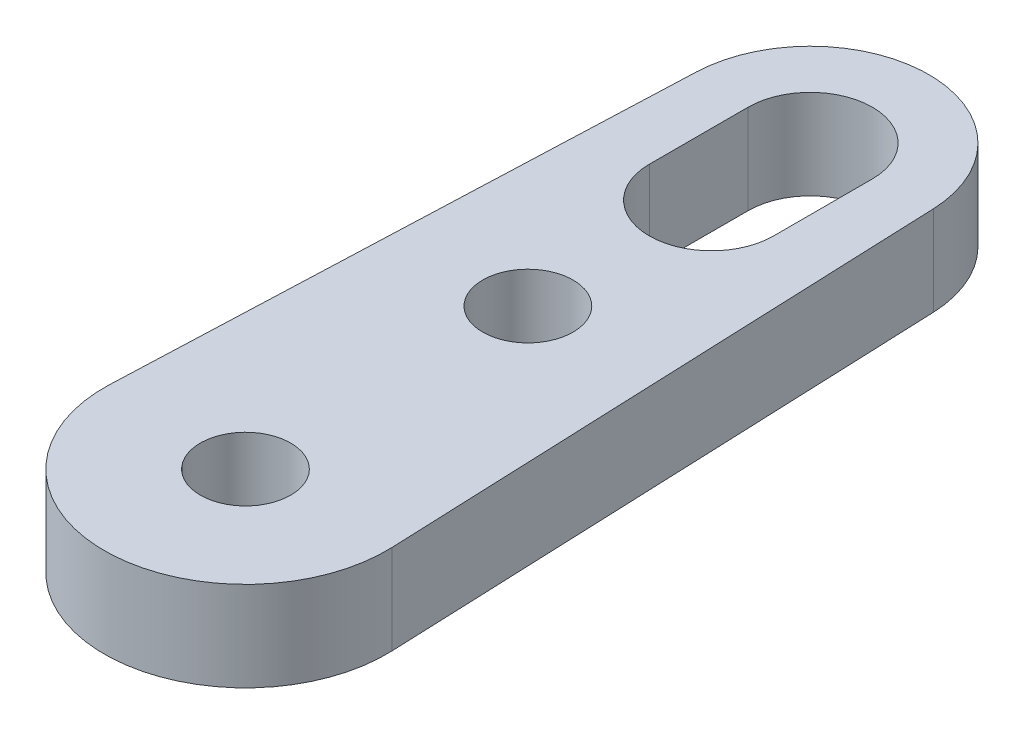
ISO-10303-21;
HEADER;
FILE_DESCRIPTION(('STEP AP214'),'2;1');
FILE_NAME('part.step','',(''),(''),'','','');
FILE_SCHEMA(('AUTOMOTIVE_DESIGN { 1 0 10303 214 1 1 1 1 }'));
ENDSEC;
DATA;
#1=APPLICATION_CONTEXT('core data for automotive mechanical design processes');
#2=APPLICATION_PROTOCOL_DEFINITION('international standard','automotive_design',2000,#1);
#3=PRODUCT_CONTEXT('',#1,'mechanical');
#4=PRODUCT('Part','Part','',(#3));
#5=PRODUCT_RELATED_PRODUCT_CATEGORY('part','',(#4));
#6=PRODUCT_DEFINITION_FORMATION('','',#4);
#7=PRODUCT_DEFINITION_CONTEXT('part definition',#1,'design');
#8=PRODUCT_DEFINITION('design','',#6,#7);
#9=PRODUCT_DEFINITION_SHAPE('','',#8);
#10=(LENGTH_UNIT() NAMED_UNIT(*) SI_UNIT(.MILLI.,.METRE.));
#11=(NAMED_UNIT(*) PLANE_ANGLE_UNIT() SI_UNIT($,.RADIAN.));
#12=(NAMED_UNIT(*) SI_UNIT($,.STERADIAN.) SOLID_ANGLE_UNIT());
#13=UNCERTAINTY_MEASURE_WITH_UNIT(LENGTH_MEASURE(1.E-05),#10,'distance_accuracy_value','');
#14=(GEOMETRIC_REPRESENTATION_CONTEXT(3) GLOBAL_UNCERTAINTY_ASSIGNED_CONTEXT((#13)) GLOBAL_UNIT_ASSIGNED_CONTEXT((#10,
#11,#12)) REPRESENTATION_CONTEXT('',''));
#15=CARTESIAN_POINT('',(0.,0.,0.));
#16=DIRECTION('',(0.,0.,1.));
#17=DIRECTION('',(1.,0.,0.));
#18=AXIS2_PLACEMENT_3D('',#15,#16,#17);
#19=CARTESIAN_POINT('',(0.,3.175,-20.));
#20=DIRECTION('',(0.,-1.,0.));
#21=DIRECTION('',(0.,0.,-1.));
#22=AXIS2_PLACEMENT_3D('',#19,#20,#21);
#23=CYLINDRICAL_SURFACE('',#22,4.2);
#24=CARTESIAN_POINT('',(0.,0.,-20.));
#25=DIRECTION('',(0.,1.,0.));
#26=DIRECTION('',(0.,0.,1.));
#27=AXIS2_PLACEMENT_3D('',#24,#25,#26);
#28=CIRCLE('',#27,4.2);
#29=CARTESIAN_POINT('',(4.19663865492372,0.,-20.168));
#30=VERTEX_POINT('',#29);
#31=CARTESIAN_POINT('',(-4.19663865492372,0.,-20.168));
#32=VERTEX_POINT('',#31);
#33=EDGE_CURVE('E137',#30,#32,#28,.T.);
#34=ORIENTED_EDGE('',*,*,#33,.T.);
#35=DIRECTION('',(0.,-1.,0.));
#36=VECTOR('',#35,1.);
#37=CARTESIAN_POINT('',(-4.19663865492372,3.175,-20.168));
#38=LINE('',#37,#36);
#39=CARTESIAN_POINT('',(-4.19663865492372,3.175,-20.168));
#40=VERTEX_POINT('',#39);
#41=EDGE_CURVE('E11',#40,#32,#38,.T.);
#42=ORIENTED_EDGE('',*,*,#41,.F.);
#43=CARTESIAN_POINT('',(0.,3.175,-20.));
#44=DIRECTION('',(0.,1.,0.));
#45=DIRECTION('',(0.,0.,1.));
#46=AXIS2_PLACEMENT_3D('',#43,#44,#45);
#47=CIRCLE('',#46,4.2);
#48=CARTESIAN_POINT('',(4.19663865492372,3.175,-20.168));
#49=VERTEX_POINT('',#48);
#50=EDGE_CURVE('E146',#49,#40,#47,.T.);
#51=ORIENTED_EDGE('',*,*,#50,.F.);
#52=DIRECTION('',(0.,-1.,0.));
#53=VECTOR('',#52,1.);
#54=CARTESIAN_POINT('',(4.19663865492372,3.175,-20.168));
#55=LINE('',#54,#53);
#56=EDGE_CURVE('E156',#49,#30,#55,.T.);
#57=ORIENTED_EDGE('',*,*,#56,.T.);
#58=EDGE_LOOP('',(#34,#42,#51,#57));
#59=FACE_BOUND('',#58,.T.);
#60=ADVANCED_FACE('F33',(#59),#23,.T.);
#61=CARTESIAN_POINT('',(-4.19663865492372,3.175,-20.168));
#62=DIRECTION('',(0.999199679743744,0.,0.04));
#63=DIRECTION('',(0.04,0.,-0.999199679743744));
#64=AXIS2_PLACEMENT_3D('',#61,#62,#63);
#65=PLANE('',#64);
#66=DIRECTION('',(-0.04,0.,0.999199679743744));
#67=VECTOR('',#66,1.);
#68=CARTESIAN_POINT('',(-4.19663865492372,0.,-20.168));
#69=LINE('',#68,#67);
#70=CARTESIAN_POINT('',(-4.99599839871872,0.,-0.2));
#71=VERTEX_POINT('',#70);
#72=EDGE_CURVE('E159',#32,#71,#69,.T.);
#73=ORIENTED_EDGE('',*,*,#72,.T.);
#74=DIRECTION('',(0.,-1.,0.));
#75=VECTOR('',#74,1.);
#76=CARTESIAN_POINT('',(-4.99599839871872,3.175,-0.2));
#77=LINE('',#76,#75);
#78=CARTESIAN_POINT('',(-4.99599839871872,3.175,-0.2));
#79=VERTEX_POINT('',#78);
#80=EDGE_CURVE('E40',#79,#71,#77,.T.);
#81=ORIENTED_EDGE('',*,*,#80,.F.);
#82=DIRECTION('',(-0.04,0.,0.999199679743744));
#83=VECTOR('',#82,1.);
#84=CARTESIAN_POINT('',(-4.19663865492372,3.175,-20.168));
#85=LINE('',#84,#83);
#86=EDGE_CURVE('E149',#40,#79,#85,.T.);
#87=ORIENTED_EDGE('',*,*,#86,.F.);
#88=ORIENTED_EDGE('',*,*,#41,.T.);
#89=EDGE_LOOP('',(#73,#81,#87,#88));
#90=FACE_BOUND('',#89,.T.);
#91=ADVANCED_FACE('F188',(#90),#65,.F.);
#92=CARTESIAN_POINT('',(0.,3.175,0.));
#93=DIRECTION('',(0.,-1.,0.));
#94=DIRECTION('',(0.,0.,-1.));
#95=AXIS2_PLACEMENT_3D('',#92,#93,#94);
#96=CYLINDRICAL_SURFACE('',#95,5.);
#97=CARTESIAN_POINT('',(0.,0.,0.));
#98=DIRECTION('',(0.,1.,0.));
#99=DIRECTION('',(0.,0.,1.));
#100=AXIS2_PLACEMENT_3D('',#97,#98,#99);
#101=CIRCLE('',#100,5.);
#102=CARTESIAN_POINT('',(4.99599839871872,0.,-0.200000000000001));
#103=VERTEX_POINT('',#102);
#104=EDGE_CURVE('E161',#71,#103,#101,.T.);
#105=ORIENTED_EDGE('',*,*,#104,.T.);
#106=DIRECTION('',(0.,-1.,0.));
#107=VECTOR('',#106,1.);
#108=CARTESIAN_POINT('',(4.99599839871872,3.175,-0.200000000000001));
#109=LINE('',#108,#107);
#110=CARTESIAN_POINT('',(4.99599839871872,3.175,-0.200000000000001));
#111=VERTEX_POINT('',#110);
#112=EDGE_CURVE('E166',#111,#103,#109,.T.);
#113=ORIENTED_EDGE('',*,*,#112,.F.);
#114=CARTESIAN_POINT('',(0.,3.175,0.));
#115=DIRECTION('',(0.,1.,0.));
#116=DIRECTION('',(0.,0.,1.));
#117=AXIS2_PLACEMENT_3D('',#114,#115,#116);
#118=CIRCLE('',#117,5.);
#119=EDGE_CURVE('E152',#79,#111,#118,.T.);
#120=ORIENTED_EDGE('',*,*,#119,.F.);
#121=ORIENTED_EDGE('',*,*,#80,.T.);
#122=EDGE_LOOP('',(#105,#113,#120,#121));
#123=FACE_BOUND('',#122,.T.);
#124=ADVANCED_FACE('F173',(#123),#96,.T.);
#125=CARTESIAN_POINT('',(4.19663865492372,3.175,-20.168));
#126=DIRECTION('',(-0.999199679743744,0.,0.04));
#127=DIRECTION('',(0.04,0.,0.999199679743744));
#128=AXIS2_PLACEMENT_3D('',#125,#126,#127);
#129=PLANE('',#128);
#130=DIRECTION('',(-0.04,0.,-0.999199679743744));
#131=VECTOR('',#130,1.);
#132=CARTESIAN_POINT('',(4.19663865492372,0.,-20.168));
#133=LINE('',#132,#131);
#134=EDGE_CURVE('E150',#103,#30,#133,.T.);
#135=ORIENTED_EDGE('',*,*,#134,.T.);
#136=ORIENTED_EDGE('',*,*,#56,.F.);
#137=DIRECTION('',(-0.04,0.,-0.999199679743744));
#138=VECTOR('',#137,1.);
#139=CARTESIAN_POINT('',(4.19663865492372,3.175,-20.168));
#140=LINE('',#139,#138);
#141=EDGE_CURVE('E154',#111,#49,#140,.T.);
#142=ORIENTED_EDGE('',*,*,#141,.F.);
#143=ORIENTED_EDGE('',*,*,#112,.T.);
#144=EDGE_LOOP('',(#135,#136,#142,#143));
#145=FACE_BOUND('',#144,.T.);
#146=ADVANCED_FACE('F181',(#145),#129,.F.);
#147=CARTESIAN_POINT('',(0.,3.175,-20.));
#148=DIRECTION('',(0.,1.,0.));
#149=DIRECTION('',(0.,0.,1.));
#150=AXIS2_PLACEMENT_3D('',#147,#148,#149);
#151=PLANE('',#150);
#152=CARTESIAN_POINT('',(0.,3.175,-16.5));
#153=DIRECTION('',(0.,1.,0.));
#154=DIRECTION('',(0.,0.,1.));
#155=AXIS2_PLACEMENT_3D('',#152,#153,#154);
#156=CIRCLE('',#155,2.2);
#157=CARTESIAN_POINT('',(-2.2,3.175,-16.5));
#158=VERTEX_POINT('',#157);
#159=CARTESIAN_POINT('',(2.2,3.175,-16.5));
#160=VERTEX_POINT('',#159);
#161=EDGE_CURVE('E47',#158,#160,#156,.T.);
#162=ORIENTED_EDGE('',*,*,#161,.F.);
#163=DIRECTION('',(0.,0.,1.));
#164=VECTOR('',#163,1.);
#165=CARTESIAN_POINT('',(-2.2,3.175,-16.5));
#166=LINE('',#165,#164);
#167=CARTESIAN_POINT('',(-2.2,3.175,-20.));
#168=VERTEX_POINT('',#167);
#169=EDGE_CURVE('E115',#168,#158,#166,.T.);
#170=ORIENTED_EDGE('',*,*,#169,.F.);
#171=CARTESIAN_POINT('',(0.,3.175,-20.));
#172=DIRECTION('',(0.,1.,0.));
#173=DIRECTION('',(0.,0.,1.));
#174=AXIS2_PLACEMENT_3D('',#171,#172,#173);
#175=CIRCLE('',#174,2.2);
#176=CARTESIAN_POINT('',(2.2,3.175,-20.));
#177=VERTEX_POINT('',#176);
#178=EDGE_CURVE('E118',#177,#168,#175,.T.);
#179=ORIENTED_EDGE('',*,*,#178,.F.);
#180=DIRECTION('',(0.,0.,-1.));
#181=VECTOR('',#180,1.);
#182=CARTESIAN_POINT('',(2.2,3.175,-16.5));
#183=LINE('',#182,#181);
#184=EDGE_CURVE('E124',#160,#177,#183,.T.);
#185=ORIENTED_EDGE('',*,*,#184,.F.);
#186=EDGE_LOOP('',(#162,#170,#179,#185));
#187=FACE_BOUND('',#186,.T.);
#188=CARTESIAN_POINT('',(0.,3.175,0.));
#189=DIRECTION('',(0.,1.,0.));
#190=DIRECTION('',(0.,0.,1.));
#191=AXIS2_PLACEMENT_3D('',#188,#189,#190);
#192=CIRCLE('',#191,1.6);
#193=CARTESIAN_POINT('',(0.,3.175,1.6));
#194=VERTEX_POINT('',#193);
#195=EDGE_CURVE('E138',#194,#194,#192,.T.);
#196=ORIENTED_EDGE('',*,*,#195,.F.);
#197=EDGE_LOOP('',(#196));
#198=FACE_BOUND('',#197,.T.);
#199=CARTESIAN_POINT('',(0.,3.175,-10.));
#200=DIRECTION('',(0.,1.,0.));
#201=DIRECTION('',(0.,0.,1.));
#202=AXIS2_PLACEMENT_3D('',#199,#200,#201);
#203=CIRCLE('',#202,1.6);
#204=CARTESIAN_POINT('',(0.,3.175,-8.4));
#205=VERTEX_POINT('',#204);
#206=EDGE_CURVE('E130',#205,#205,#203,.T.);
#207=ORIENTED_EDGE('',*,*,#206,.F.);
#208=EDGE_LOOP('',(#207));
#209=FACE_BOUND('',#208,.T.);
#210=ORIENTED_EDGE('',*,*,#50,.T.);
#211=ORIENTED_EDGE('',*,*,#86,.T.);
#212=ORIENTED_EDGE('',*,*,#119,.T.);
#213=ORIENTED_EDGE('',*,*,#141,.T.);
#214=EDGE_LOOP('',(#210,#211,#212,#213));
#215=FACE_BOUND('',#214,.T.);
#216=ADVANCED_FACE('F187',(#187,#198,#209,#215),#151,.T.);
#217=CARTESIAN_POINT('',(0.,0.,-20.));
#218=DIRECTION('',(0.,1.,0.));
#219=DIRECTION('',(0.,0.,1.));
#220=AXIS2_PLACEMENT_3D('',#217,#218,#219);
#221=PLANE('',#220);
#222=DIRECTION('',(0.,0.,1.));
#223=VECTOR('',#222,1.);
#224=CARTESIAN_POINT('',(-2.2,0.,-16.5));
#225=LINE('',#224,#223);
#226=CARTESIAN_POINT('',(-2.2,0.,-20.));
#227=VERTEX_POINT('',#226);
#228=CARTESIAN_POINT('',(-2.2,0.,-16.5));
#229=VERTEX_POINT('',#228);
#230=EDGE_CURVE('E105',#227,#229,#225,.T.);
#231=ORIENTED_EDGE('',*,*,#230,.T.);
#232=CARTESIAN_POINT('',(0.,0.,-16.5));
#233=DIRECTION('',(0.,1.,0.));
#234=DIRECTION('',(0.,0.,1.));
#235=AXIS2_PLACEMENT_3D('',#232,#233,#234);
#236=CIRCLE('',#235,2.2);
#237=CARTESIAN_POINT('',(2.2,0.,-16.5));
#238=VERTEX_POINT('',#237);
#239=EDGE_CURVE('E99',#229,#238,#236,.T.);
#240=ORIENTED_EDGE('',*,*,#239,.T.);
#241=DIRECTION('',(0.,0.,-1.));
#242=VECTOR('',#241,1.);
#243=CARTESIAN_POINT('',(2.2,0.,-16.5));
#244=LINE('',#243,#242);
#245=CARTESIAN_POINT('',(2.2,0.,-20.));
#246=VERTEX_POINT('',#245);
#247=EDGE_CURVE('E108',#238,#246,#244,.T.);
#248=ORIENTED_EDGE('',*,*,#247,.T.);
#249=CARTESIAN_POINT('',(0.,0.,-20.));
#250=DIRECTION('',(0.,1.,0.));
#251=DIRECTION('',(0.,0.,1.));
#252=AXIS2_PLACEMENT_3D('',#249,#250,#251);
#253=CIRCLE('',#252,2.2);
#254=EDGE_CURVE('E55',#246,#227,#253,.T.);
#255=ORIENTED_EDGE('',*,*,#254,.T.);
#256=EDGE_LOOP('',(#231,#240,#248,#255));
#257=FACE_BOUND('',#256,.T.);
#258=CARTESIAN_POINT('',(0.,0.,0.));
#259=DIRECTION('',(0.,1.,0.));
#260=DIRECTION('',(0.,0.,1.));
#261=AXIS2_PLACEMENT_3D('',#258,#259,#260);
#262=CIRCLE('',#261,1.6);
#263=CARTESIAN_POINT('',(0.,0.,1.6));
#264=VERTEX_POINT('',#263);
#265=EDGE_CURVE('E134',#264,#264,#262,.T.);
#266=ORIENTED_EDGE('',*,*,#265,.T.);
#267=EDGE_LOOP('',(#266));
#268=FACE_BOUND('',#267,.T.);
#269=CARTESIAN_POINT('',(0.,0.,-10.));
#270=DIRECTION('',(0.,1.,0.));
#271=DIRECTION('',(0.,0.,1.));
#272=AXIS2_PLACEMENT_3D('',#269,#270,#271);
#273=CIRCLE('',#272,1.6);
#274=CARTESIAN_POINT('',(0.,0.,-8.4));
#275=VERTEX_POINT('',#274);
#276=EDGE_CURVE('E141',#275,#275,#273,.T.);
#277=ORIENTED_EDGE('',*,*,#276,.T.);
#278=EDGE_LOOP('',(#277));
#279=FACE_BOUND('',#278,.T.);
#280=ORIENTED_EDGE('',*,*,#33,.F.);
#281=ORIENTED_EDGE('',*,*,#134,.F.);
#282=ORIENTED_EDGE('',*,*,#104,.F.);
#283=ORIENTED_EDGE('',*,*,#72,.F.);
#284=EDGE_LOOP('',(#280,#281,#282,#283));
#285=FACE_BOUND('',#284,.T.);
#286=ADVANCED_FACE('F112',(#257,#268,#279,#285),#221,.F.);
#287=CARTESIAN_POINT('',(0.,0.,-10.));
#288=DIRECTION('',(0.,1.,0.));
#289=DIRECTION('',(0.,0.,1.));
#290=AXIS2_PLACEMENT_3D('',#287,#288,#289);
#291=CYLINDRICAL_SURFACE('',#290,1.6);
#292=ORIENTED_EDGE('',*,*,#276,.F.);
#293=EDGE_LOOP('',(#292));
#294=FACE_BOUND('',#293,.T.);
#295=ORIENTED_EDGE('',*,*,#206,.T.);
#296=EDGE_LOOP('',(#295));
#297=FACE_BOUND('',#296,.T.);
#298=ADVANCED_FACE('F200',(#294,#297),#291,.F.);
#299=CARTESIAN_POINT('',(0.,0.,0.));
#300=DIRECTION('',(0.,1.,0.));
#301=DIRECTION('',(0.,0.,1.));
#302=AXIS2_PLACEMENT_3D('',#299,#300,#301);
#303=CYLINDRICAL_SURFACE('',#302,1.6);
#304=ORIENTED_EDGE('',*,*,#265,.F.);
#305=EDGE_LOOP('',(#304));
#306=FACE_BOUND('',#305,.T.);
#307=ORIENTED_EDGE('',*,*,#195,.T.);
#308=EDGE_LOOP('',(#307));
#309=FACE_BOUND('',#308,.T.);
#310=ADVANCED_FACE('F206',(#306,#309),#303,.F.);
#311=CARTESIAN_POINT('',(0.,0.,-16.5));
#312=DIRECTION('',(0.,1.,0.));
#313=DIRECTION('',(0.,0.,1.));
#314=AXIS2_PLACEMENT_3D('',#311,#312,#313);
#315=CYLINDRICAL_SURFACE('',#314,2.2);
#316=ORIENTED_EDGE('',*,*,#161,.T.);
#317=DIRECTION('',(0.,1.,0.));
#318=VECTOR('',#317,1.);
#319=CARTESIAN_POINT('',(2.2,0.,-16.5));
#320=LINE('',#319,#318);
#321=EDGE_CURVE('E95',#238,#160,#320,.T.);
#322=ORIENTED_EDGE('',*,*,#321,.F.);
#323=ORIENTED_EDGE('',*,*,#239,.F.);
#324=DIRECTION('',(0.,1.,0.));
#325=VECTOR('',#324,1.);
#326=CARTESIAN_POINT('',(-2.2,0.,-16.5));
#327=LINE('',#326,#325);
#328=EDGE_CURVE('E128',#229,#158,#327,.T.);
#329=ORIENTED_EDGE('',*,*,#328,.T.);
#330=EDGE_LOOP('',(#316,#322,#323,#329));
#331=FACE_BOUND('',#330,.T.);
#332=ADVANCED_FACE('F97',(#331),#315,.F.);
#333=CARTESIAN_POINT('',(-2.2,0.,-16.5));
#334=DIRECTION('',(-1.,0.,0.));
#335=DIRECTION('',(0.,0.,1.));
#336=AXIS2_PLACEMENT_3D('',#333,#334,#335);
#337=PLANE('',#336);
#338=ORIENTED_EDGE('',*,*,#169,.T.);
#339=ORIENTED_EDGE('',*,*,#328,.F.);
#340=ORIENTED_EDGE('',*,*,#230,.F.);
#341=DIRECTION('',(0.,1.,0.));
#342=VECTOR('',#341,1.);
#343=CARTESIAN_POINT('',(-2.2,0.,-20.));
#344=LINE('',#343,#342);
#345=EDGE_CURVE('E131',#227,#168,#344,.T.);
#346=ORIENTED_EDGE('',*,*,#345,.T.);
#347=EDGE_LOOP('',(#338,#339,#340,#346));
#348=FACE_BOUND('',#347,.T.);
#349=ADVANCED_FACE('F213',(#348),#337,.F.);
#350=CARTESIAN_POINT('',(0.,0.,-20.));
#351=DIRECTION('',(0.,1.,0.));
#352=DIRECTION('',(0.,0.,1.));
#353=AXIS2_PLACEMENT_3D('',#350,#351,#352);
#354=CYLINDRICAL_SURFACE('',#353,2.2);
#355=ORIENTED_EDGE('',*,*,#178,.T.);
#356=ORIENTED_EDGE('',*,*,#345,.F.);
#357=ORIENTED_EDGE('',*,*,#254,.F.);
#358=DIRECTION('',(0.,1.,0.));
#359=VECTOR('',#358,1.);
#360=CARTESIAN_POINT('',(2.2,0.,-20.));
#361=LINE('',#360,#359);
#362=EDGE_CURVE('E104',#246,#177,#361,.T.);
#363=ORIENTED_EDGE('',*,*,#362,.T.);
#364=EDGE_LOOP('',(#355,#356,#357,#363));
#365=FACE_BOUND('',#364,.T.);
#366=ADVANCED_FACE('F216',(#365),#354,.F.);
#367=CARTESIAN_POINT('',(2.2,0.,-16.5));
#368=DIRECTION('',(1.,0.,0.));
#369=DIRECTION('',(0.,0.,-1.));
#370=AXIS2_PLACEMENT_3D('',#367,#368,#369);
#371=PLANE('',#370);
#372=ORIENTED_EDGE('',*,*,#184,.T.);
#373=ORIENTED_EDGE('',*,*,#362,.F.);
#374=ORIENTED_EDGE('',*,*,#247,.F.);
#375=ORIENTED_EDGE('',*,*,#321,.T.);
#376=EDGE_LOOP('',(#372,#373,#374,#375));
#377=FACE_BOUND('',#376,.T.);
#378=ADVANCED_FACE('F109',(#377),#371,.F.);
#379=CLOSED_SHELL('',(#60,#91,#124,#146,#216,#286,#298,#310,#332,#349,#366,#378));
#380=MANIFOLD_SOLID_BREP('B2',#379);
#381=ADVANCED_BREP_SHAPE_REPRESENTATION('',(#18,#380),#14);
#382=SHAPE_DEFINITION_REPRESENTATION(#9,#381);
ENDSEC;
END-ISO-10303-21;
